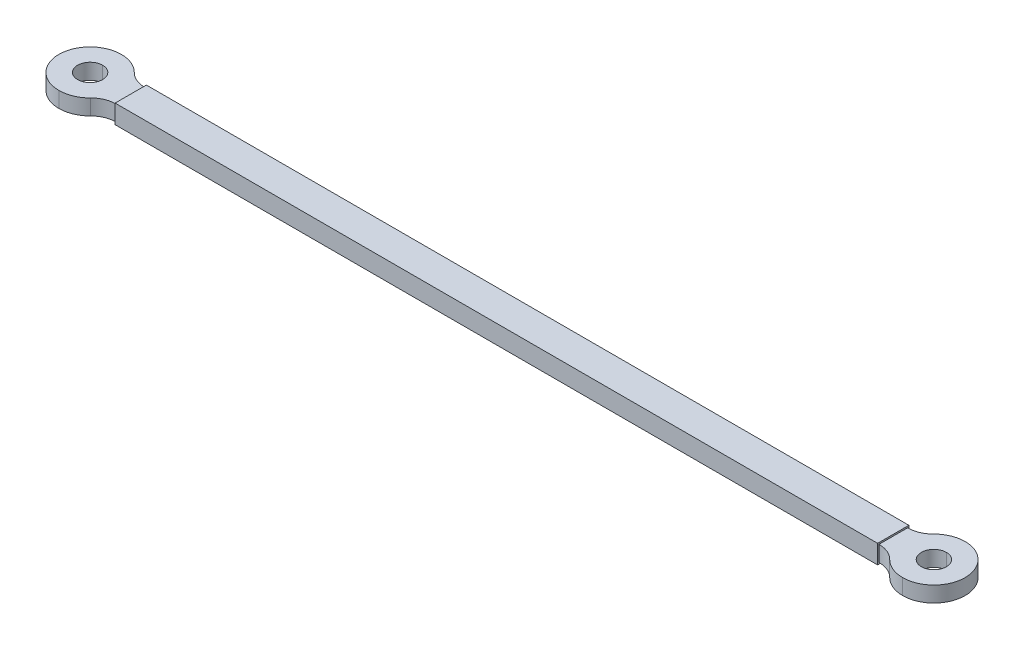
ISO-10303-21;
HEADER;
FILE_DESCRIPTION(('STEP AP214'),'2;1');
FILE_NAME('part.step','',(''),(''),'','','');
FILE_SCHEMA(('AUTOMOTIVE_DESIGN { 1 0 10303 214 1 1 1 1 }'));
ENDSEC;
DATA;
#1=APPLICATION_CONTEXT('core data for automotive mechanical design processes');
#2=APPLICATION_PROTOCOL_DEFINITION('international standard','automotive_design',2000,#1);
#3=PRODUCT_CONTEXT('',#1,'mechanical');
#4=PRODUCT('Part','Part','',(#3));
#5=PRODUCT_RELATED_PRODUCT_CATEGORY('part','',(#4));
#6=PRODUCT_DEFINITION_FORMATION('','',#4);
#7=PRODUCT_DEFINITION_CONTEXT('part definition',#1,'design');
#8=PRODUCT_DEFINITION('design','',#6,#7);
#9=PRODUCT_DEFINITION_SHAPE('','',#8);
#10=(LENGTH_UNIT() NAMED_UNIT(*) SI_UNIT(.MILLI.,.METRE.));
#11=(NAMED_UNIT(*) PLANE_ANGLE_UNIT() SI_UNIT($,.RADIAN.));
#12=(NAMED_UNIT(*) SI_UNIT($,.STERADIAN.) SOLID_ANGLE_UNIT());
#13=UNCERTAINTY_MEASURE_WITH_UNIT(LENGTH_MEASURE(1.E-05),#10,'distance_accuracy_value','');
#14=(GEOMETRIC_REPRESENTATION_CONTEXT(3) GLOBAL_UNCERTAINTY_ASSIGNED_CONTEXT((#13)) GLOBAL_UNIT_ASSIGNED_CONTEXT((#10,
#11,#12)) REPRESENTATION_CONTEXT('',''));
#15=CARTESIAN_POINT('',(0.,0.,0.));
#16=DIRECTION('',(0.,0.,1.));
#17=DIRECTION('',(1.,0.,0.));
#18=AXIS2_PLACEMENT_3D('',#15,#16,#17);
#19=CARTESIAN_POINT('',(1994.71999940355,-142.250000000009,2369.25442435895));
#20=DIRECTION('',(0.,-1.,0.));
#21=DIRECTION('',(0.,0.,-1.));
#22=AXIS2_PLACEMENT_3D('',#19,#20,#21);
#23=CYLINDRICAL_SURFACE('',#22,20.);
#24=DIRECTION('',(0.,-1.,0.));
#25=VECTOR('',#24,1.);
#26=CARTESIAN_POINT('',(1994.71999940355,-142.25000000001,2389.25442435895));
#27=LINE('',#26,#25);
#28=CARTESIAN_POINT('',(1994.71999940355,-144.75000000001,2389.25442435895));
#29=VERTEX_POINT('',#28);
#30=CARTESIAN_POINT('',(1994.71999940355,-169.75000000001,2389.25442435895));
#31=VERTEX_POINT('',#30);
#32=EDGE_CURVE('E393',#29,#31,#27,.T.);
#33=ORIENTED_EDGE('',*,*,#32,.F.);
#34=CARTESIAN_POINT('',(1994.71999940355,-144.75000000001,2369.25442435895));
#35=DIRECTION('',(0.,-1.,0.));
#36=DIRECTION('',(0.,0.,-1.));
#37=AXIS2_PLACEMENT_3D('',#34,#35,#36);
#38=CIRCLE('',#37,20.);
#39=CARTESIAN_POINT('',(1994.71999940355,-144.75000000001,2349.25442435895));
#40=VERTEX_POINT('',#39);
#41=EDGE_CURVE('E366',#40,#29,#38,.T.);
#42=ORIENTED_EDGE('',*,*,#41,.F.);
#43=DIRECTION('',(0.,-1.,0.));
#44=VECTOR('',#43,1.);
#45=CARTESIAN_POINT('',(1994.71999940355,-142.250000000009,2349.25442435895));
#46=LINE('',#45,#44);
#47=CARTESIAN_POINT('',(1994.71999940355,-169.750000000009,2349.25442435895));
#48=VERTEX_POINT('',#47);
#49=EDGE_CURVE('E401',#40,#48,#46,.T.);
#50=ORIENTED_EDGE('',*,*,#49,.T.);
#51=CARTESIAN_POINT('',(1994.71999940355,-169.750000000009,2369.25442435895));
#52=DIRECTION('',(0.,-1.,0.));
#53=DIRECTION('',(0.,0.,-1.));
#54=AXIS2_PLACEMENT_3D('',#51,#52,#53);
#55=CIRCLE('',#54,20.);
#56=EDGE_CURVE('E471',#48,#31,#55,.T.);
#57=ORIENTED_EDGE('',*,*,#56,.T.);
#58=EDGE_LOOP('',(#33,#42,#50,#57));
#59=FACE_BOUND('',#58,.T.);
#60=ADVANCED_FACE('F17',(#59),#23,.F.);
#61=CARTESIAN_POINT('',(1994.71999940355,-169.750000000009,2369.25442435895));
#62=DIRECTION('',(0.,1.,0.));
#63=DIRECTION('',(0.,0.,1.));
#64=AXIS2_PLACEMENT_3D('',#61,#62,#63);
#65=CYLINDRICAL_SURFACE('',#64,50.);
#66=DIRECTION('',(0.,1.,0.));
#67=VECTOR('',#66,1.);
#68=CARTESIAN_POINT('',(1994.71999940355,-169.750000000009,2319.25442435895));
#69=LINE('',#68,#67);
#70=CARTESIAN_POINT('',(1994.71999940355,-169.750000000009,2319.25442435895));
#71=VERTEX_POINT('',#70);
#72=CARTESIAN_POINT('',(1994.71999940355,-144.75000000001,2319.25442435895));
#73=VERTEX_POINT('',#72);
#74=EDGE_CURVE('E328',#71,#73,#69,.T.);
#75=ORIENTED_EDGE('',*,*,#74,.F.);
#76=CARTESIAN_POINT('',(1994.71999940355,-169.750000000009,2369.25442435895));
#77=DIRECTION('',(0.,1.,0.));
#78=DIRECTION('',(0.,0.,1.));
#79=AXIS2_PLACEMENT_3D('',#76,#77,#78);
#80=CIRCLE('',#79,50.);
#81=CARTESIAN_POINT('',(1959.01234706811,-169.750000000009,2334.25494486723));
#82=VERTEX_POINT('',#81);
#83=EDGE_CURVE('E472',#71,#82,#80,.T.);
#84=ORIENTED_EDGE('',*,*,#83,.T.);
#85=DIRECTION('',(0.,1.,0.));
#86=VECTOR('',#85,1.);
#87=CARTESIAN_POINT('',(1959.01234706811,-169.750000000009,2334.25494486723));
#88=LINE('',#87,#86);
#89=CARTESIAN_POINT('',(1959.01234706811,-144.75000000001,2334.25494486723));
#90=VERTEX_POINT('',#89);
#91=EDGE_CURVE('E11',#82,#90,#88,.T.);
#92=ORIENTED_EDGE('',*,*,#91,.T.);
#93=CARTESIAN_POINT('',(1994.71999940355,-144.75000000001,2369.25442435895));
#94=DIRECTION('',(0.,1.,0.));
#95=DIRECTION('',(0.,0.,1.));
#96=AXIS2_PLACEMENT_3D('',#93,#94,#95);
#97=CIRCLE('',#96,50.);
#98=EDGE_CURVE('E498',#73,#90,#97,.T.);
#99=ORIENTED_EDGE('',*,*,#98,.F.);
#100=EDGE_LOOP('',(#75,#84,#92,#99));
#101=FACE_BOUND('',#100,.T.);
#102=ADVANCED_FACE('F558',(#101),#65,.T.);
#103=CARTESIAN_POINT('',(1930.44622519976,-169.750000000009,2306.25536127386));
#104=DIRECTION('',(0.,1.,0.));
#105=DIRECTION('',(0.,0.,1.));
#106=AXIS2_PLACEMENT_3D('',#103,#104,#105);
#107=CYLINDRICAL_SURFACE('',#106,40.);
#108=CARTESIAN_POINT('',(1930.44622519976,-169.750000000009,2306.25536127386));
#109=DIRECTION('',(0.,-1.,0.));
#110=DIRECTION('',(0.,0.,1.));
#111=AXIS2_PLACEMENT_3D('',#108,#109,#110);
#112=CIRCLE('',#111,40.);
#113=CARTESIAN_POINT('',(1930.71999940356,-169.750000000009,2346.25442435895));
#114=VERTEX_POINT('',#113);
#115=EDGE_CURVE('E338',#82,#114,#112,.T.);
#116=ORIENTED_EDGE('',*,*,#115,.T.);
#117=DIRECTION('',(0.,1.,0.));
#118=VECTOR('',#117,1.);
#119=CARTESIAN_POINT('',(1930.71999940355,-169.750000000009,2346.25442435895));
#120=LINE('',#119,#118);
#121=CARTESIAN_POINT('',(1930.71999940356,-144.75000000001,2346.25442435895));
#122=VERTEX_POINT('',#121);
#123=EDGE_CURVE('E166',#114,#122,#120,.T.);
#124=ORIENTED_EDGE('',*,*,#123,.T.);
#125=CARTESIAN_POINT('',(1930.44622519976,-144.75000000001,2306.25536127386));
#126=DIRECTION('',(0.,-1.,0.));
#127=DIRECTION('',(0.,0.,1.));
#128=AXIS2_PLACEMENT_3D('',#125,#126,#127);
#129=CIRCLE('',#128,40.);
#130=EDGE_CURVE('E524',#90,#122,#129,.T.);
#131=ORIENTED_EDGE('',*,*,#130,.F.);
#132=ORIENTED_EDGE('',*,*,#91,.F.);
#133=EDGE_LOOP('',(#116,#124,#131,#132));
#134=FACE_BOUND('',#133,.T.);
#135=ADVANCED_FACE('F555',(#134),#107,.F.);
#136=CARTESIAN_POINT('',(1930.44622519975,-169.75000000001,2432.25348744404));
#137=DIRECTION('',(0.,1.,0.));
#138=DIRECTION('',(0.,0.,1.));
#139=AXIS2_PLACEMENT_3D('',#136,#137,#138);
#140=CYLINDRICAL_SURFACE('',#139,40.);
#141=CARTESIAN_POINT('',(1930.44622519975,-169.75000000001,2432.25348744404));
#142=DIRECTION('',(0.,-1.,0.));
#143=DIRECTION('',(0.,0.,1.));
#144=AXIS2_PLACEMENT_3D('',#141,#142,#143);
#145=CIRCLE('',#144,40.);
#146=CARTESIAN_POINT('',(1930.71999940351,-169.75000000001,2392.25442435895));
#147=VERTEX_POINT('',#146);
#148=CARTESIAN_POINT('',(1959.01234706811,-169.75000000001,2404.25390385067));
#149=VERTEX_POINT('',#148);
#150=EDGE_CURVE('E193',#147,#149,#145,.T.);
#151=ORIENTED_EDGE('',*,*,#150,.T.);
#152=DIRECTION('',(0.,-1.,0.));
#153=VECTOR('',#152,1.);
#154=CARTESIAN_POINT('',(1959.01234706811,-169.75000000001,2404.25390385067));
#155=LINE('',#154,#153);
#156=CARTESIAN_POINT('',(1959.01234706811,-144.75000000001,2404.25390385067));
#157=VERTEX_POINT('',#156);
#158=EDGE_CURVE('E386',#157,#149,#155,.T.);
#159=ORIENTED_EDGE('',*,*,#158,.F.);
#160=CARTESIAN_POINT('',(1930.44622519975,-144.75000000001,2432.25348744404));
#161=DIRECTION('',(0.,-1.,0.));
#162=DIRECTION('',(0.,0.,1.));
#163=AXIS2_PLACEMENT_3D('',#160,#161,#162);
#164=CIRCLE('',#163,40.);
#165=CARTESIAN_POINT('',(1930.71999940351,-144.75000000001,2392.25442435895));
#166=VERTEX_POINT('',#165);
#167=EDGE_CURVE('E157',#166,#157,#164,.T.);
#168=ORIENTED_EDGE('',*,*,#167,.F.);
#169=DIRECTION('',(0.,-1.,0.));
#170=VECTOR('',#169,1.);
#171=CARTESIAN_POINT('',(1930.71999940352,-169.75000000001,2392.25442435895));
#172=LINE('',#171,#170);
#173=EDGE_CURVE('E369',#166,#147,#172,.T.);
#174=ORIENTED_EDGE('',*,*,#173,.T.);
#175=EDGE_LOOP('',(#151,#159,#168,#174));
#176=FACE_BOUND('',#175,.T.);
#177=ADVANCED_FACE('F557',(#176),#140,.F.);
#178=CARTESIAN_POINT('',(644.719999403547,-142.250000000009,2369.25442435894));
#179=DIRECTION('',(0.,-1.,0.));
#180=DIRECTION('',(0.,0.,-1.));
#181=AXIS2_PLACEMENT_3D('',#178,#179,#180);
#182=CYLINDRICAL_SURFACE('',#181,20.);
#183=DIRECTION('',(0.,-1.,0.));
#184=VECTOR('',#183,1.);
#185=CARTESIAN_POINT('',(644.719999403547,-142.25000000001,2389.25442435894));
#186=LINE('',#185,#184);
#187=CARTESIAN_POINT('',(644.719999403547,-144.75000000001,2389.25442435894));
#188=VERTEX_POINT('',#187);
#189=CARTESIAN_POINT('',(644.719999403547,-169.75000000001,2389.25442435894));
#190=VERTEX_POINT('',#189);
#191=EDGE_CURVE('E321',#188,#190,#186,.T.);
#192=ORIENTED_EDGE('',*,*,#191,.F.);
#193=CARTESIAN_POINT('',(644.719999403547,-144.75000000001,2369.25442435894));
#194=DIRECTION('',(0.,-1.,0.));
#195=DIRECTION('',(0.,0.,-1.));
#196=AXIS2_PLACEMENT_3D('',#193,#194,#195);
#197=CIRCLE('',#196,20.);
#198=CARTESIAN_POINT('',(644.719999403547,-144.75000000001,2349.25442435894));
#199=VERTEX_POINT('',#198);
#200=EDGE_CURVE('E501',#199,#188,#197,.T.);
#201=ORIENTED_EDGE('',*,*,#200,.F.);
#202=DIRECTION('',(0.,-1.,0.));
#203=VECTOR('',#202,1.);
#204=CARTESIAN_POINT('',(644.719999403547,-142.250000000009,2349.25442435894));
#205=LINE('',#204,#203);
#206=CARTESIAN_POINT('',(644.719999403547,-169.750000000009,2349.25442435894));
#207=VERTEX_POINT('',#206);
#208=EDGE_CURVE('E320',#199,#207,#205,.T.);
#209=ORIENTED_EDGE('',*,*,#208,.T.);
#210=CARTESIAN_POINT('',(644.719999403547,-169.750000000009,2369.25442435894));
#211=DIRECTION('',(0.,-1.,0.));
#212=DIRECTION('',(0.,0.,-1.));
#213=AXIS2_PLACEMENT_3D('',#210,#211,#212);
#214=CIRCLE('',#213,20.);
#215=EDGE_CURVE('E235',#207,#190,#214,.T.);
#216=ORIENTED_EDGE('',*,*,#215,.T.);
#217=EDGE_LOOP('',(#192,#201,#209,#216));
#218=FACE_BOUND('',#217,.T.);
#219=ADVANCED_FACE('F565',(#218),#182,.F.);
#220=CARTESIAN_POINT('',(708.993773607341,-169.750000000009,2306.25536127385));
#221=DIRECTION('',(0.,1.,0.));
#222=DIRECTION('',(0.,0.,1.));
#223=AXIS2_PLACEMENT_3D('',#220,#221,#222);
#224=CYLINDRICAL_SURFACE('',#223,40.);
#225=CARTESIAN_POINT('',(708.993773607341,-169.750000000009,2306.25536127385));
#226=DIRECTION('',(0.,-1.,0.));
#227=DIRECTION('',(0.,0.,1.));
#228=AXIS2_PLACEMENT_3D('',#225,#226,#227);
#229=CIRCLE('',#228,40.);
#230=CARTESIAN_POINT('',(708.719999403527,-169.750000000009,2346.25442435894));
#231=VERTEX_POINT('',#230);
#232=CARTESIAN_POINT('',(680.427651738988,-169.750000000009,2334.25494486722));
#233=VERTEX_POINT('',#232);
#234=EDGE_CURVE('E282',#231,#233,#229,.T.);
#235=ORIENTED_EDGE('',*,*,#234,.T.);
#236=DIRECTION('',(0.,-1.,0.));
#237=VECTOR('',#236,1.);
#238=CARTESIAN_POINT('',(680.427651738988,-169.750000000009,2334.25494486722));
#239=LINE('',#238,#237);
#240=CARTESIAN_POINT('',(680.427651738988,-144.75000000001,2334.25494486722));
#241=VERTEX_POINT('',#240);
#242=EDGE_CURVE('E285',#241,#233,#239,.T.);
#243=ORIENTED_EDGE('',*,*,#242,.F.);
#244=CARTESIAN_POINT('',(708.993773607341,-144.75000000001,2306.25536127385));
#245=DIRECTION('',(0.,-1.,0.));
#246=DIRECTION('',(0.,0.,1.));
#247=AXIS2_PLACEMENT_3D('',#244,#245,#246);
#248=CIRCLE('',#247,40.);
#249=CARTESIAN_POINT('',(708.719999403527,-144.75000000001,2346.25442435894));
#250=VERTEX_POINT('',#249);
#251=EDGE_CURVE('E251',#250,#241,#248,.T.);
#252=ORIENTED_EDGE('',*,*,#251,.F.);
#253=DIRECTION('',(0.,-1.,0.));
#254=VECTOR('',#253,1.);
#255=CARTESIAN_POINT('',(708.719999403536,-169.750000000009,2346.25442435894));
#256=LINE('',#255,#254);
#257=EDGE_CURVE('E288',#250,#231,#256,.T.);
#258=ORIENTED_EDGE('',*,*,#257,.T.);
#259=EDGE_LOOP('',(#235,#243,#252,#258));
#260=FACE_BOUND('',#259,.T.);
#261=ADVANCED_FACE('F284',(#260),#224,.F.);
#262=CARTESIAN_POINT('',(644.719999403547,-169.750000000009,2369.25442435894));
#263=DIRECTION('',(0.,1.,0.));
#264=DIRECTION('',(0.,0.,1.));
#265=AXIS2_PLACEMENT_3D('',#262,#263,#264);
#266=CYLINDRICAL_SURFACE('',#265,50.);
#267=DIRECTION('',(0.,1.,0.));
#268=VECTOR('',#267,1.);
#269=CARTESIAN_POINT('',(644.719999403547,-169.75000000001,2419.25442435894));
#270=LINE('',#269,#268);
#271=CARTESIAN_POINT('',(644.719999403547,-169.75000000001,2419.25442435894));
#272=VERTEX_POINT('',#271);
#273=CARTESIAN_POINT('',(644.719999403547,-144.75000000001,2419.25442435894));
#274=VERTEX_POINT('',#273);
#275=EDGE_CURVE('E334',#272,#274,#270,.T.);
#276=ORIENTED_EDGE('',*,*,#275,.F.);
#277=CARTESIAN_POINT('',(644.719999403547,-169.750000000009,2369.25442435894));
#278=DIRECTION('',(0.,1.,0.));
#279=DIRECTION('',(0.,0.,1.));
#280=AXIS2_PLACEMENT_3D('',#277,#278,#279);
#281=CIRCLE('',#280,50.);
#282=CARTESIAN_POINT('',(680.427651738988,-169.75000000001,2404.25390385066));
#283=VERTEX_POINT('',#282);
#284=EDGE_CURVE('E292',#272,#283,#281,.T.);
#285=ORIENTED_EDGE('',*,*,#284,.T.);
#286=DIRECTION('',(0.,1.,0.));
#287=VECTOR('',#286,1.);
#288=CARTESIAN_POINT('',(680.427651738988,-169.75000000001,2404.25390385066));
#289=LINE('',#288,#287);
#290=CARTESIAN_POINT('',(680.427651738988,-144.75000000001,2404.25390385066));
#291=VERTEX_POINT('',#290);
#292=EDGE_CURVE('E26',#283,#291,#289,.T.);
#293=ORIENTED_EDGE('',*,*,#292,.T.);
#294=CARTESIAN_POINT('',(644.719999403547,-144.75000000001,2369.25442435894));
#295=DIRECTION('',(0.,1.,0.));
#296=DIRECTION('',(0.,0.,1.));
#297=AXIS2_PLACEMENT_3D('',#294,#295,#296);
#298=CIRCLE('',#297,50.);
#299=EDGE_CURVE('E487',#274,#291,#298,.T.);
#300=ORIENTED_EDGE('',*,*,#299,.F.);
#301=EDGE_LOOP('',(#276,#285,#293,#300));
#302=FACE_BOUND('',#301,.T.);
#303=ADVANCED_FACE('F835',(#302),#266,.T.);
#304=CARTESIAN_POINT('',(708.993773607341,-169.75000000001,2432.25348744404));
#305=DIRECTION('',(0.,1.,0.));
#306=DIRECTION('',(0.,0.,1.));
#307=AXIS2_PLACEMENT_3D('',#304,#305,#306);
#308=CYLINDRICAL_SURFACE('',#307,40.);
#309=CARTESIAN_POINT('',(708.993773607341,-169.75000000001,2432.25348744404));
#310=DIRECTION('',(0.,-1.,0.));
#311=DIRECTION('',(0.,0.,1.));
#312=AXIS2_PLACEMENT_3D('',#309,#310,#311);
#313=CIRCLE('',#312,40.);
#314=CARTESIAN_POINT('',(708.719999403527,-169.75000000001,2392.25442435894));
#315=VERTEX_POINT('',#314);
#316=EDGE_CURVE('E459',#283,#315,#313,.T.);
#317=ORIENTED_EDGE('',*,*,#316,.T.);
#318=DIRECTION('',(0.,1.,0.));
#319=VECTOR('',#318,1.);
#320=CARTESIAN_POINT('',(708.719999403536,-169.75000000001,2392.25442435894));
#321=LINE('',#320,#319);
#322=CARTESIAN_POINT('',(708.719999403527,-144.75000000001,2392.25442435894));
#323=VERTEX_POINT('',#322);
#324=EDGE_CURVE('E504',#315,#323,#321,.T.);
#325=ORIENTED_EDGE('',*,*,#324,.T.);
#326=CARTESIAN_POINT('',(708.993773607341,-144.75000000001,2432.25348744404));
#327=DIRECTION('',(0.,-1.,0.));
#328=DIRECTION('',(0.,0.,1.));
#329=AXIS2_PLACEMENT_3D('',#326,#327,#328);
#330=CIRCLE('',#329,40.);
#331=EDGE_CURVE('E491',#291,#323,#330,.T.);
#332=ORIENTED_EDGE('',*,*,#331,.F.);
#333=ORIENTED_EDGE('',*,*,#292,.F.);
#334=EDGE_LOOP('',(#317,#325,#332,#333));
#335=FACE_BOUND('',#334,.T.);
#336=ADVANCED_FACE('F824',(#335),#308,.F.);
#337=CARTESIAN_POINT('',(1930.44622519976,-144.750000000009,2306.25536127386));
#338=DIRECTION('',(0.,1.,0.));
#339=DIRECTION('',(0.,0.,-1.));
#340=AXIS2_PLACEMENT_3D('',#337,#338,#339);
#341=PLANE('',#340);
#342=ORIENTED_EDGE('',*,*,#41,.T.);
#343=CARTESIAN_POINT('',(1994.71999940355,-144.75000000001,2369.25442435895));
#344=DIRECTION('',(0.,-1.,0.));
#345=DIRECTION('',(0.,0.,-1.));
#346=AXIS2_PLACEMENT_3D('',#343,#344,#345);
#347=CIRCLE('',#346,20.);
#348=EDGE_CURVE('E389',#29,#40,#347,.T.);
#349=ORIENTED_EDGE('',*,*,#348,.T.);
#350=EDGE_LOOP('',(#342,#349));
#351=FACE_BOUND('',#350,.T.);
#352=ORIENTED_EDGE('',*,*,#167,.T.);
#353=CARTESIAN_POINT('',(1994.71999940355,-144.75000000001,2369.25442435895));
#354=DIRECTION('',(0.,1.,0.));
#355=DIRECTION('',(0.,0.,1.));
#356=AXIS2_PLACEMENT_3D('',#353,#354,#355);
#357=CIRCLE('',#356,50.);
#358=CARTESIAN_POINT('',(1994.71999940355,-144.75000000001,2419.25442435895));
#359=VERTEX_POINT('',#358);
#360=EDGE_CURVE('E377',#157,#359,#357,.T.);
#361=ORIENTED_EDGE('',*,*,#360,.T.);
#362=CARTESIAN_POINT('',(1994.71999940355,-144.75000000001,2369.25442435895));
#363=DIRECTION('',(0.,1.,0.));
#364=DIRECTION('',(0.,0.,1.));
#365=AXIS2_PLACEMENT_3D('',#362,#363,#364);
#366=CIRCLE('',#365,50.);
#367=EDGE_CURVE('E359',#359,#73,#366,.T.);
#368=ORIENTED_EDGE('',*,*,#367,.T.);
#369=ORIENTED_EDGE('',*,*,#98,.T.);
#370=ORIENTED_EDGE('',*,*,#130,.T.);
#371=DIRECTION('',(-1.,0.,0.));
#372=VECTOR('',#371,1.);
#373=CARTESIAN_POINT('',(1930.71999940354,-144.75000000001,2346.25442435895));
#374=LINE('',#373,#372);
#375=CARTESIAN_POINT('',(1929.71999940354,-144.75000000001,2346.25442435895));
#376=VERTEX_POINT('',#375);
#377=EDGE_CURVE('E516',#122,#376,#374,.T.);
#378=ORIENTED_EDGE('',*,*,#377,.T.);
#379=DIRECTION('',(0.,0.,-1.));
#380=VECTOR('',#379,1.);
#381=CARTESIAN_POINT('',(1929.71999940354,-144.75000000001,2344.25442435895));
#382=LINE('',#381,#380);
#383=CARTESIAN_POINT('',(1929.71999940354,-144.75000000001,2392.25442435895));
#384=VERTEX_POINT('',#383);
#385=EDGE_CURVE('E455',#384,#376,#382,.T.);
#386=ORIENTED_EDGE('',*,*,#385,.F.);
#387=DIRECTION('',(1.,0.,0.));
#388=VECTOR('',#387,1.);
#389=CARTESIAN_POINT('',(1930.71999940354,-144.75000000001,2392.25442435895));
#390=LINE('',#389,#388);
#391=EDGE_CURVE('E339',#384,#166,#390,.T.);
#392=ORIENTED_EDGE('',*,*,#391,.T.);
#393=EDGE_LOOP('',(#352,#361,#368,#369,#370,#378,#386,#392));
#394=FACE_BOUND('',#393,.T.);
#395=ADVANCED_FACE('F531',(#351,#394),#341,.T.);
#396=CARTESIAN_POINT('',(1930.71999940354,-169.750000000009,2346.25442435895));
#397=DIRECTION('',(0.,0.,1.));
#398=DIRECTION('',(0.,-1.,0.));
#399=AXIS2_PLACEMENT_3D('',#396,#397,#398);
#400=PLANE('',#399);
#401=ORIENTED_EDGE('',*,*,#377,.F.);
#402=ORIENTED_EDGE('',*,*,#123,.F.);
#403=DIRECTION('',(-1.,0.,0.));
#404=VECTOR('',#403,1.);
#405=CARTESIAN_POINT('',(1930.44622519976,-169.750000000009,2346.25442435895));
#406=LINE('',#405,#404);
#407=CARTESIAN_POINT('',(1929.71999940354,-169.750000000009,2346.25442435895));
#408=VERTEX_POINT('',#407);
#409=EDGE_CURVE('E335',#114,#408,#406,.T.);
#410=ORIENTED_EDGE('',*,*,#409,.T.);
#411=DIRECTION('',(0.,-1.,0.));
#412=VECTOR('',#411,1.);
#413=CARTESIAN_POINT('',(1929.71999940354,-142.25000000001,2346.25442435895));
#414=LINE('',#413,#412);
#415=EDGE_CURVE('E463',#376,#408,#414,.T.);
#416=ORIENTED_EDGE('',*,*,#415,.F.);
#417=EDGE_LOOP('',(#401,#402,#410,#416));
#418=FACE_BOUND('',#417,.T.);
#419=ADVANCED_FACE('F543',(#418),#400,.F.);
#420=CARTESIAN_POINT('',(1930.44622519976,-169.750000000009,2306.25536127386));
#421=DIRECTION('',(0.,1.,0.));
#422=DIRECTION('',(0.,0.,-1.));
#423=AXIS2_PLACEMENT_3D('',#420,#421,#422);
#424=PLANE('',#423);
#425=ORIENTED_EDGE('',*,*,#56,.F.);
#426=CARTESIAN_POINT('',(1994.71999940355,-169.750000000009,2369.25442435895));
#427=DIRECTION('',(0.,-1.,0.));
#428=DIRECTION('',(0.,0.,-1.));
#429=AXIS2_PLACEMENT_3D('',#426,#427,#428);
#430=CIRCLE('',#429,20.);
#431=EDGE_CURVE('E397',#31,#48,#430,.T.);
#432=ORIENTED_EDGE('',*,*,#431,.F.);
#433=EDGE_LOOP('',(#425,#432));
#434=FACE_BOUND('',#433,.T.);
#435=ORIENTED_EDGE('',*,*,#409,.F.);
#436=ORIENTED_EDGE('',*,*,#115,.F.);
#437=ORIENTED_EDGE('',*,*,#83,.F.);
#438=CARTESIAN_POINT('',(1994.71999940355,-169.750000000009,2369.25442435895));
#439=DIRECTION('',(0.,1.,0.));
#440=DIRECTION('',(0.,0.,1.));
#441=AXIS2_PLACEMENT_3D('',#438,#439,#440);
#442=CIRCLE('',#441,50.);
#443=CARTESIAN_POINT('',(1994.71999940355,-169.75000000001,2419.25442435895));
#444=VERTEX_POINT('',#443);
#445=EDGE_CURVE('E324',#444,#71,#442,.T.);
#446=ORIENTED_EDGE('',*,*,#445,.F.);
#447=CARTESIAN_POINT('',(1994.71999940355,-169.750000000009,2369.25442435895));
#448=DIRECTION('',(0.,1.,0.));
#449=DIRECTION('',(0.,0.,1.));
#450=AXIS2_PLACEMENT_3D('',#447,#448,#449);
#451=CIRCLE('',#450,50.);
#452=EDGE_CURVE('E223',#149,#444,#451,.T.);
#453=ORIENTED_EDGE('',*,*,#452,.F.);
#454=ORIENTED_EDGE('',*,*,#150,.F.);
#455=DIRECTION('',(-1.,0.,0.));
#456=VECTOR('',#455,1.);
#457=CARTESIAN_POINT('',(1930.71999940354,-169.75000000001,2392.25442435895));
#458=LINE('',#457,#456);
#459=CARTESIAN_POINT('',(1929.71999940354,-169.75000000001,2392.25442435895));
#460=VERTEX_POINT('',#459);
#461=EDGE_CURVE('E507',#147,#460,#458,.T.);
#462=ORIENTED_EDGE('',*,*,#461,.T.);
#463=DIRECTION('',(0.,0.,1.));
#464=VECTOR('',#463,1.);
#465=CARTESIAN_POINT('',(1929.71999940354,-169.750000000009,2344.25442435895));
#466=LINE('',#465,#464);
#467=EDGE_CURVE('E344',#408,#460,#466,.T.);
#468=ORIENTED_EDGE('',*,*,#467,.F.);
#469=EDGE_LOOP('',(#435,#436,#437,#446,#453,#454,#462,#468));
#470=FACE_BOUND('',#469,.T.);
#471=ADVANCED_FACE('F539',(#434,#470),#424,.F.);
#472=CARTESIAN_POINT('',(1930.71999940354,-169.75000000001,2392.25442435895));
#473=DIRECTION('',(0.,0.,-1.));
#474=DIRECTION('',(0.,-1.,0.));
#475=AXIS2_PLACEMENT_3D('',#472,#473,#474);
#476=PLANE('',#475);
#477=ORIENTED_EDGE('',*,*,#461,.F.);
#478=ORIENTED_EDGE('',*,*,#173,.F.);
#479=ORIENTED_EDGE('',*,*,#391,.F.);
#480=DIRECTION('',(0.,1.,0.));
#481=VECTOR('',#480,1.);
#482=CARTESIAN_POINT('',(1929.71999940354,-142.25000000001,2392.25442435895));
#483=LINE('',#482,#481);
#484=EDGE_CURVE('E348',#460,#384,#483,.T.);
#485=ORIENTED_EDGE('',*,*,#484,.F.);
#486=EDGE_LOOP('',(#477,#478,#479,#485));
#487=FACE_BOUND('',#486,.T.);
#488=ADVANCED_FACE('F542',(#487),#476,.F.);
#489=CARTESIAN_POINT('',(708.719999403547,-169.75000000001,2392.25442435894));
#490=DIRECTION('',(0.,0.,-1.));
#491=DIRECTION('',(0.,-1.,0.));
#492=AXIS2_PLACEMENT_3D('',#489,#490,#491);
#493=PLANE('',#492);
#494=ORIENTED_EDGE('',*,*,#324,.F.);
#495=DIRECTION('',(1.,0.,0.));
#496=VECTOR('',#495,1.);
#497=CARTESIAN_POINT('',(708.993773607341,-169.75000000001,2392.25442435894));
#498=LINE('',#497,#496);
#499=CARTESIAN_POINT('',(709.719999403547,-169.75000000001,2392.25442435894));
#500=VERTEX_POINT('',#499);
#501=EDGE_CURVE('E374',#315,#500,#498,.T.);
#502=ORIENTED_EDGE('',*,*,#501,.T.);
#503=DIRECTION('',(0.,1.,0.));
#504=VECTOR('',#503,1.);
#505=CARTESIAN_POINT('',(709.719999403547,-142.25000000001,2392.25442435894));
#506=LINE('',#505,#504);
#507=CARTESIAN_POINT('',(709.719999403547,-144.75000000001,2392.25442435894));
#508=VERTEX_POINT('',#507);
#509=EDGE_CURVE('E440',#500,#508,#506,.T.);
#510=ORIENTED_EDGE('',*,*,#509,.T.);
#511=DIRECTION('',(1.,0.,0.));
#512=VECTOR('',#511,1.);
#513=CARTESIAN_POINT('',(708.993773607341,-144.75000000001,2392.25442435894));
#514=LINE('',#513,#512);
#515=EDGE_CURVE('E495',#323,#508,#514,.T.);
#516=ORIENTED_EDGE('',*,*,#515,.F.);
#517=EDGE_LOOP('',(#494,#502,#510,#516));
#518=FACE_BOUND('',#517,.T.);
#519=ADVANCED_FACE('F684',(#518),#493,.F.);
#520=CARTESIAN_POINT('',(708.993773607341,-144.75000000001,2432.25348744404));
#521=DIRECTION('',(0.,1.,0.));
#522=DIRECTION('',(0.,0.,-1.));
#523=AXIS2_PLACEMENT_3D('',#520,#521,#522);
#524=PLANE('',#523);
#525=ORIENTED_EDGE('',*,*,#200,.T.);
#526=CARTESIAN_POINT('',(644.719999403547,-144.75000000001,2369.25442435894));
#527=DIRECTION('',(0.,-1.,0.));
#528=DIRECTION('',(0.,0.,-1.));
#529=AXIS2_PLACEMENT_3D('',#526,#527,#528);
#530=CIRCLE('',#529,20.);
#531=EDGE_CURVE('E333',#188,#199,#530,.T.);
#532=ORIENTED_EDGE('',*,*,#531,.T.);
#533=EDGE_LOOP('',(#525,#532));
#534=FACE_BOUND('',#533,.T.);
#535=DIRECTION('',(-1.,0.,0.));
#536=VECTOR('',#535,1.);
#537=CARTESIAN_POINT('',(708.719999403547,-144.75000000001,2346.25442435894));
#538=LINE('',#537,#536);
#539=CARTESIAN_POINT('',(709.719999403547,-144.75000000001,2346.25442435894));
#540=VERTEX_POINT('',#539);
#541=EDGE_CURVE('E482',#540,#250,#538,.T.);
#542=ORIENTED_EDGE('',*,*,#541,.T.);
#543=ORIENTED_EDGE('',*,*,#251,.T.);
#544=CARTESIAN_POINT('',(644.719999403547,-144.75000000001,2369.25442435894));
#545=DIRECTION('',(0.,1.,0.));
#546=DIRECTION('',(0.,0.,1.));
#547=AXIS2_PLACEMENT_3D('',#544,#545,#546);
#548=CIRCLE('',#547,50.);
#549=CARTESIAN_POINT('',(644.719999403547,-144.75000000001,2319.25442435894));
#550=VERTEX_POINT('',#549);
#551=EDGE_CURVE('E299',#241,#550,#548,.T.);
#552=ORIENTED_EDGE('',*,*,#551,.T.);
#553=CARTESIAN_POINT('',(644.719999403547,-144.75000000001,2369.25442435894));
#554=DIRECTION('',(0.,1.,0.));
#555=DIRECTION('',(0.,0.,1.));
#556=AXIS2_PLACEMENT_3D('',#553,#554,#555);
#557=CIRCLE('',#556,50.);
#558=EDGE_CURVE('E265',#550,#274,#557,.T.);
#559=ORIENTED_EDGE('',*,*,#558,.T.);
#560=ORIENTED_EDGE('',*,*,#299,.T.);
#561=ORIENTED_EDGE('',*,*,#331,.T.);
#562=ORIENTED_EDGE('',*,*,#515,.T.);
#563=DIRECTION('',(0.,0.,-1.));
#564=VECTOR('',#563,1.);
#565=CARTESIAN_POINT('',(709.719999403547,-144.75000000001,2344.25442435894));
#566=LINE('',#565,#564);
#567=EDGE_CURVE('E382',#508,#540,#566,.T.);
#568=ORIENTED_EDGE('',*,*,#567,.T.);
#569=EDGE_LOOP('',(#542,#543,#552,#559,#560,#561,#562,#568));
#570=FACE_BOUND('',#569,.T.);
#571=ADVANCED_FACE('F689',(#534,#570),#524,.T.);
#572=CARTESIAN_POINT('',(708.719999403547,-169.750000000009,2346.25442435894));
#573=DIRECTION('',(0.,0.,1.));
#574=DIRECTION('',(0.,-1.,0.));
#575=AXIS2_PLACEMENT_3D('',#572,#573,#574);
#576=PLANE('',#575);
#577=ORIENTED_EDGE('',*,*,#257,.F.);
#578=ORIENTED_EDGE('',*,*,#541,.F.);
#579=DIRECTION('',(0.,-1.,0.));
#580=VECTOR('',#579,1.);
#581=CARTESIAN_POINT('',(709.719999403547,-142.25000000001,2346.25442435894));
#582=LINE('',#581,#580);
#583=CARTESIAN_POINT('',(709.719999403547,-169.750000000009,2346.25442435894));
#584=VERTEX_POINT('',#583);
#585=EDGE_CURVE('E378',#540,#584,#582,.T.);
#586=ORIENTED_EDGE('',*,*,#585,.T.);
#587=DIRECTION('',(-1.,0.,0.));
#588=VECTOR('',#587,1.);
#589=CARTESIAN_POINT('',(708.993773607341,-169.750000000009,2346.25442435894));
#590=LINE('',#589,#588);
#591=EDGE_CURVE('E291',#584,#231,#590,.T.);
#592=ORIENTED_EDGE('',*,*,#591,.T.);
#593=EDGE_LOOP('',(#577,#578,#586,#592));
#594=FACE_BOUND('',#593,.T.);
#595=ADVANCED_FACE('F656',(#594),#576,.F.);
#596=CARTESIAN_POINT('',(708.993773607341,-169.75000000001,2432.25348744404));
#597=DIRECTION('',(0.,1.,0.));
#598=DIRECTION('',(0.,0.,-1.));
#599=AXIS2_PLACEMENT_3D('',#596,#597,#598);
#600=PLANE('',#599);
#601=ORIENTED_EDGE('',*,*,#215,.F.);
#602=CARTESIAN_POINT('',(644.719999403547,-169.750000000009,2369.25442435894));
#603=DIRECTION('',(0.,-1.,0.));
#604=DIRECTION('',(0.,0.,-1.));
#605=AXIS2_PLACEMENT_3D('',#602,#603,#604);
#606=CIRCLE('',#605,20.);
#607=EDGE_CURVE('E316',#190,#207,#606,.T.);
#608=ORIENTED_EDGE('',*,*,#607,.F.);
#609=EDGE_LOOP('',(#601,#608));
#610=FACE_BOUND('',#609,.T.);
#611=ORIENTED_EDGE('',*,*,#316,.F.);
#612=ORIENTED_EDGE('',*,*,#284,.F.);
#613=CARTESIAN_POINT('',(644.719999403547,-169.750000000009,2369.25442435894));
#614=DIRECTION('',(0.,1.,0.));
#615=DIRECTION('',(0.,0.,1.));
#616=AXIS2_PLACEMENT_3D('',#613,#614,#615);
#617=CIRCLE('',#616,50.);
#618=CARTESIAN_POINT('',(644.719999403547,-169.750000000009,2319.25442435894));
#619=VERTEX_POINT('',#618);
#620=EDGE_CURVE('E273',#619,#272,#617,.T.);
#621=ORIENTED_EDGE('',*,*,#620,.F.);
#622=CARTESIAN_POINT('',(644.719999403547,-169.750000000009,2369.25442435894));
#623=DIRECTION('',(0.,1.,0.));
#624=DIRECTION('',(0.,0.,1.));
#625=AXIS2_PLACEMENT_3D('',#622,#623,#624);
#626=CIRCLE('',#625,50.);
#627=EDGE_CURVE('E298',#233,#619,#626,.T.);
#628=ORIENTED_EDGE('',*,*,#627,.F.);
#629=ORIENTED_EDGE('',*,*,#234,.F.);
#630=ORIENTED_EDGE('',*,*,#591,.F.);
#631=DIRECTION('',(0.,0.,1.));
#632=VECTOR('',#631,1.);
#633=CARTESIAN_POINT('',(709.719999403547,-169.750000000009,2344.25442435894));
#634=LINE('',#633,#632);
#635=EDGE_CURVE('E444',#584,#500,#634,.T.);
#636=ORIENTED_EDGE('',*,*,#635,.T.);
#637=ORIENTED_EDGE('',*,*,#501,.F.);
#638=EDGE_LOOP('',(#611,#612,#621,#628,#629,#630,#636,#637));
#639=FACE_BOUND('',#638,.T.);
#640=ADVANCED_FACE('F303',(#610,#639),#600,.F.);
#641=CARTESIAN_POINT('',(709.719999403546,-172.25000000001,2394.25442435894));
#642=DIRECTION('',(0.,1.,0.));
#643=DIRECTION('',(0.,0.,-1.));
#644=AXIS2_PLACEMENT_3D('',#641,#642,#643);
#645=PLANE('',#644);
#646=DIRECTION('',(0.,0.,-1.));
#647=VECTOR('',#646,1.);
#648=CARTESIAN_POINT('',(709.719999403547,-172.25000000001,2344.25442435894));
#649=LINE('',#648,#647);
#650=CARTESIAN_POINT('',(709.719999403547,-172.25000000001,2394.25442435894));
#651=VERTEX_POINT('',#650);
#652=CARTESIAN_POINT('',(709.719999403547,-172.250000000009,2344.25442435895));
#653=VERTEX_POINT('',#652);
#654=EDGE_CURVE('E383',#651,#653,#649,.T.);
#655=ORIENTED_EDGE('',*,*,#654,.T.);
#656=DIRECTION('',(1.,0.,0.));
#657=VECTOR('',#656,1.);
#658=CARTESIAN_POINT('',(709.719999403547,-172.250000000009,2344.25442435894));
#659=LINE('',#658,#657);
#660=CARTESIAN_POINT('',(1929.71999940354,-172.250000000009,2344.25442435895));
#661=VERTEX_POINT('',#660);
#662=EDGE_CURVE('E417',#653,#661,#659,.T.);
#663=ORIENTED_EDGE('',*,*,#662,.T.);
#664=DIRECTION('',(0.,0.,-1.));
#665=VECTOR('',#664,1.);
#666=CARTESIAN_POINT('',(1929.71999940354,-172.25000000001,2344.25442435895));
#667=LINE('',#666,#665);
#668=CARTESIAN_POINT('',(1929.71999940354,-172.25000000001,2394.25442435895));
#669=VERTEX_POINT('',#668);
#670=EDGE_CURVE('E349',#669,#661,#667,.T.);
#671=ORIENTED_EDGE('',*,*,#670,.F.);
#672=DIRECTION('',(-1.,0.,0.));
#673=VECTOR('',#672,1.);
#674=CARTESIAN_POINT('',(709.719999403546,-172.25000000001,2394.25442435894));
#675=LINE('',#674,#673);
#676=EDGE_CURVE('E434',#669,#651,#675,.T.);
#677=ORIENTED_EDGE('',*,*,#676,.T.);
#678=EDGE_LOOP('',(#655,#663,#671,#677));
#679=FACE_BOUND('',#678,.T.);
#680=ADVANCED_FACE('F655',(#679),#645,.F.);
#681=CARTESIAN_POINT('',(1929.71999940354,-142.25000000001,2344.25442435895));
#682=DIRECTION('',(1.,0.,0.));
#683=DIRECTION('',(0.,1.,0.));
#684=AXIS2_PLACEMENT_3D('',#681,#682,#683);
#685=PLANE('',#684);
#686=ORIENTED_EDGE('',*,*,#467,.T.);
#687=ORIENTED_EDGE('',*,*,#484,.T.);
#688=ORIENTED_EDGE('',*,*,#385,.T.);
#689=ORIENTED_EDGE('',*,*,#415,.T.);
#690=EDGE_LOOP('',(#686,#687,#688,#689));
#691=FACE_BOUND('',#690,.T.);
#692=ORIENTED_EDGE('',*,*,#670,.T.);
#693=DIRECTION('',(0.,1.,0.));
#694=VECTOR('',#693,1.);
#695=CARTESIAN_POINT('',(1929.71999940354,-148.25000000001,2344.25442435894));
#696=LINE('',#695,#694);
#697=CARTESIAN_POINT('',(1929.71999940354,-142.25000000001,2344.25442435895));
#698=VERTEX_POINT('',#697);
#699=EDGE_CURVE('E426',#661,#698,#696,.T.);
#700=ORIENTED_EDGE('',*,*,#699,.T.);
#701=DIRECTION('',(0.,0.,1.));
#702=VECTOR('',#701,1.);
#703=CARTESIAN_POINT('',(1929.71999940354,-142.25000000001,2344.25442435894));
#704=LINE('',#703,#702);
#705=CARTESIAN_POINT('',(1929.71999940354,-142.25000000001,2394.25442435895));
#706=VERTEX_POINT('',#705);
#707=EDGE_CURVE('E313',#698,#706,#704,.T.);
#708=ORIENTED_EDGE('',*,*,#707,.T.);
#709=DIRECTION('',(0.,-1.,0.));
#710=VECTOR('',#709,1.);
#711=CARTESIAN_POINT('',(1929.71999940354,-142.25000000001,2394.25442435895));
#712=LINE('',#711,#710);
#713=EDGE_CURVE('E430',#706,#669,#712,.T.);
#714=ORIENTED_EDGE('',*,*,#713,.T.);
#715=EDGE_LOOP('',(#692,#700,#708,#714));
#716=FACE_BOUND('',#715,.T.);
#717=ADVANCED_FACE('F550',(#691,#716),#685,.T.);
#718=CARTESIAN_POINT('',(709.719999403546,-142.25000000001,2394.25442435894));
#719=DIRECTION('',(0.,0.,-1.));
#720=DIRECTION('',(0.,-1.,0.));
#721=AXIS2_PLACEMENT_3D('',#718,#719,#720);
#722=PLANE('',#721);
#723=DIRECTION('',(0.,-1.,0.));
#724=VECTOR('',#723,1.);
#725=CARTESIAN_POINT('',(709.719999403547,-142.25000000001,2394.25442435895));
#726=LINE('',#725,#724);
#727=CARTESIAN_POINT('',(709.719999403546,-142.25000000001,2394.25442435895));
#728=VERTEX_POINT('',#727);
#729=EDGE_CURVE('E413',#728,#651,#726,.T.);
#730=ORIENTED_EDGE('',*,*,#729,.T.);
#731=ORIENTED_EDGE('',*,*,#676,.F.);
#732=ORIENTED_EDGE('',*,*,#713,.F.);
#733=DIRECTION('',(-1.,0.,0.));
#734=VECTOR('',#733,1.);
#735=CARTESIAN_POINT('',(709.719999403547,-142.25000000001,2394.25442435895));
#736=LINE('',#735,#734);
#737=EDGE_CURVE('E409',#706,#728,#736,.T.);
#738=ORIENTED_EDGE('',*,*,#737,.T.);
#739=EDGE_LOOP('',(#730,#731,#732,#738));
#740=FACE_BOUND('',#739,.T.);
#741=ADVANCED_FACE('F707',(#740),#722,.F.);
#742=CARTESIAN_POINT('',(709.719999403547,-142.25000000001,2344.25442435894));
#743=DIRECTION('',(1.,0.,0.));
#744=DIRECTION('',(0.,1.,0.));
#745=AXIS2_PLACEMENT_3D('',#742,#743,#744);
#746=PLANE('',#745);
#747=ORIENTED_EDGE('',*,*,#585,.F.);
#748=ORIENTED_EDGE('',*,*,#567,.F.);
#749=ORIENTED_EDGE('',*,*,#509,.F.);
#750=ORIENTED_EDGE('',*,*,#635,.F.);
#751=EDGE_LOOP('',(#747,#748,#749,#750));
#752=FACE_BOUND('',#751,.T.);
#753=ORIENTED_EDGE('',*,*,#729,.F.);
#754=DIRECTION('',(0.,0.,-1.));
#755=VECTOR('',#754,1.);
#756=CARTESIAN_POINT('',(709.719999403546,-142.25000000001,2344.25442435894));
#757=LINE('',#756,#755);
#758=CARTESIAN_POINT('',(709.719999403547,-142.25000000001,2344.25442435894));
#759=VERTEX_POINT('',#758);
#760=EDGE_CURVE('E405',#728,#759,#757,.T.);
#761=ORIENTED_EDGE('',*,*,#760,.T.);
#762=DIRECTION('',(0.,-1.,0.));
#763=VECTOR('',#762,1.);
#764=CARTESIAN_POINT('',(709.719999403547,-148.25000000001,2344.25442435894));
#765=LINE('',#764,#763);
#766=EDGE_CURVE('E422',#759,#653,#765,.T.);
#767=ORIENTED_EDGE('',*,*,#766,.T.);
#768=ORIENTED_EDGE('',*,*,#654,.F.);
#769=EDGE_LOOP('',(#753,#761,#767,#768));
#770=FACE_BOUND('',#769,.T.);
#771=ADVANCED_FACE('F712',(#752,#770),#746,.F.);
#772=CARTESIAN_POINT('',(709.719999403547,-148.25000000001,2344.25442435894));
#773=DIRECTION('',(0.,0.,1.));
#774=DIRECTION('',(0.,-1.,0.));
#775=AXIS2_PLACEMENT_3D('',#772,#773,#774);
#776=PLANE('',#775);
#777=ORIENTED_EDGE('',*,*,#766,.F.);
#778=DIRECTION('',(1.,0.,0.));
#779=VECTOR('',#778,1.);
#780=CARTESIAN_POINT('',(709.719999403547,-142.25000000001,2344.25442435894));
#781=LINE('',#780,#779);
#782=EDGE_CURVE('E418',#759,#698,#781,.T.);
#783=ORIENTED_EDGE('',*,*,#782,.T.);
#784=ORIENTED_EDGE('',*,*,#699,.F.);
#785=ORIENTED_EDGE('',*,*,#662,.F.);
#786=EDGE_LOOP('',(#777,#783,#784,#785));
#787=FACE_BOUND('',#786,.T.);
#788=ADVANCED_FACE('F724',(#787),#776,.F.);
#789=CARTESIAN_POINT('',(709.719999403547,-142.25000000001,2344.25442435894));
#790=DIRECTION('',(0.,-1.,0.));
#791=DIRECTION('',(0.,0.,-1.));
#792=AXIS2_PLACEMENT_3D('',#789,#790,#791);
#793=PLANE('',#792);
#794=ORIENTED_EDGE('',*,*,#760,.F.);
#795=ORIENTED_EDGE('',*,*,#737,.F.);
#796=ORIENTED_EDGE('',*,*,#707,.F.);
#797=ORIENTED_EDGE('',*,*,#782,.F.);
#798=EDGE_LOOP('',(#794,#795,#796,#797));
#799=FACE_BOUND('',#798,.T.);
#800=ADVANCED_FACE('F588',(#799),#793,.F.);
#801=CARTESIAN_POINT('',(1994.71999940355,-142.250000000009,2369.25442435895));
#802=DIRECTION('',(0.,-1.,0.));
#803=DIRECTION('',(0.,0.,-1.));
#804=AXIS2_PLACEMENT_3D('',#801,#802,#803);
#805=CYLINDRICAL_SURFACE('',#804,20.);
#806=ORIENTED_EDGE('',*,*,#348,.F.);
#807=ORIENTED_EDGE('',*,*,#32,.T.);
#808=ORIENTED_EDGE('',*,*,#431,.T.);
#809=ORIENTED_EDGE('',*,*,#49,.F.);
#810=EDGE_LOOP('',(#806,#807,#808,#809));
#811=FACE_BOUND('',#810,.T.);
#812=ADVANCED_FACE('F537',(#811),#805,.F.);
#813=CARTESIAN_POINT('',(1994.71999940355,-169.750000000009,2369.25442435895));
#814=DIRECTION('',(0.,1.,0.));
#815=DIRECTION('',(0.,0.,1.));
#816=AXIS2_PLACEMENT_3D('',#813,#814,#815);
#817=CYLINDRICAL_SURFACE('',#816,50.);
#818=ORIENTED_EDGE('',*,*,#452,.T.);
#819=DIRECTION('',(0.,1.,0.));
#820=VECTOR('',#819,1.);
#821=CARTESIAN_POINT('',(1994.71999940355,-169.75000000001,2419.25442435895));
#822=LINE('',#821,#820);
#823=EDGE_CURVE('E363',#444,#359,#822,.T.);
#824=ORIENTED_EDGE('',*,*,#823,.T.);
#825=ORIENTED_EDGE('',*,*,#360,.F.);
#826=ORIENTED_EDGE('',*,*,#158,.T.);
#827=EDGE_LOOP('',(#818,#824,#825,#826));
#828=FACE_BOUND('',#827,.T.);
#829=ADVANCED_FACE('F587',(#828),#817,.T.);
#830=CARTESIAN_POINT('',(1994.71999940355,-169.750000000009,2369.25442435895));
#831=DIRECTION('',(0.,1.,0.));
#832=DIRECTION('',(0.,0.,1.));
#833=AXIS2_PLACEMENT_3D('',#830,#831,#832);
#834=CYLINDRICAL_SURFACE('',#833,50.);
#835=ORIENTED_EDGE('',*,*,#445,.T.);
#836=ORIENTED_EDGE('',*,*,#74,.T.);
#837=ORIENTED_EDGE('',*,*,#367,.F.);
#838=ORIENTED_EDGE('',*,*,#823,.F.);
#839=EDGE_LOOP('',(#835,#836,#837,#838));
#840=FACE_BOUND('',#839,.T.);
#841=ADVANCED_FACE('F598',(#840),#834,.T.);
#842=CARTESIAN_POINT('',(644.719999403547,-142.250000000009,2369.25442435894));
#843=DIRECTION('',(0.,-1.,0.));
#844=DIRECTION('',(0.,0.,-1.));
#845=AXIS2_PLACEMENT_3D('',#842,#843,#844);
#846=CYLINDRICAL_SURFACE('',#845,20.);
#847=ORIENTED_EDGE('',*,*,#531,.F.);
#848=ORIENTED_EDGE('',*,*,#191,.T.);
#849=ORIENTED_EDGE('',*,*,#607,.T.);
#850=ORIENTED_EDGE('',*,*,#208,.F.);
#851=EDGE_LOOP('',(#847,#848,#849,#850));
#852=FACE_BOUND('',#851,.T.);
#853=ADVANCED_FACE('F594',(#852),#846,.F.);
#854=CARTESIAN_POINT('',(644.719999403547,-169.750000000009,2369.25442435894));
#855=DIRECTION('',(0.,1.,0.));
#856=DIRECTION('',(0.,0.,1.));
#857=AXIS2_PLACEMENT_3D('',#854,#855,#856);
#858=CYLINDRICAL_SURFACE('',#857,50.);
#859=DIRECTION('',(0.,1.,0.));
#860=VECTOR('',#859,1.);
#861=CARTESIAN_POINT('',(644.719999403547,-169.750000000009,2319.25442435894));
#862=LINE('',#861,#860);
#863=EDGE_CURVE('E305',#619,#550,#862,.T.);
#864=ORIENTED_EDGE('',*,*,#863,.F.);
#865=ORIENTED_EDGE('',*,*,#620,.T.);
#866=ORIENTED_EDGE('',*,*,#275,.T.);
#867=ORIENTED_EDGE('',*,*,#558,.F.);
#868=EDGE_LOOP('',(#864,#865,#866,#867));
#869=FACE_BOUND('',#868,.T.);
#870=ADVANCED_FACE('F597',(#869),#858,.T.);
#871=CARTESIAN_POINT('',(644.719999403547,-169.750000000009,2369.25442435894));
#872=DIRECTION('',(0.,1.,0.));
#873=DIRECTION('',(0.,0.,1.));
#874=AXIS2_PLACEMENT_3D('',#871,#872,#873);
#875=CYLINDRICAL_SURFACE('',#874,50.);
#876=ORIENTED_EDGE('',*,*,#627,.T.);
#877=ORIENTED_EDGE('',*,*,#863,.T.);
#878=ORIENTED_EDGE('',*,*,#551,.F.);
#879=ORIENTED_EDGE('',*,*,#242,.T.);
#880=EDGE_LOOP('',(#876,#877,#878,#879));
#881=FACE_BOUND('',#880,.T.);
#882=ADVANCED_FACE('F296',(#881),#875,.T.);
#883=CLOSED_SHELL('',(#60,#102,#135,#177,#219,#261,#303,#336,#395,#419,#471,#488,#519,#571,#595,
#640,#680,#717,#741,#771,#788,#800,#812,#829,#841,#853,#870,#882));
#884=MANIFOLD_SOLID_BREP('B1',#883);
#885=ADVANCED_BREP_SHAPE_REPRESENTATION('',(#18,#884),#14);
#886=SHAPE_DEFINITION_REPRESENTATION(#9,#885);
ENDSEC;
END-ISO-10303-21;
